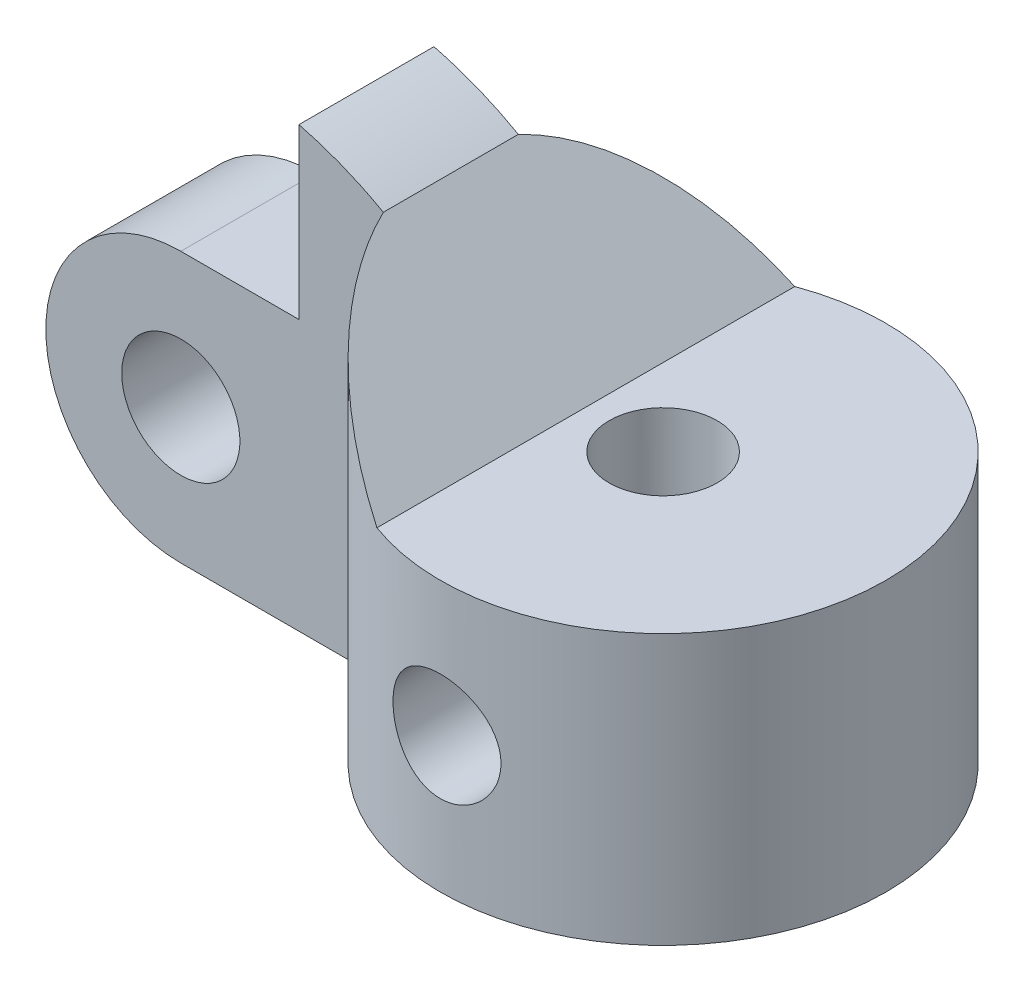
ISO-10303-21;
HEADER;
FILE_DESCRIPTION(('STEP AP214'),'2;1');
FILE_NAME('part.step','',(''),(''),'','','');
FILE_SCHEMA(('AUTOMOTIVE_DESIGN { 1 0 10303 214 1 1 1 1 }'));
ENDSEC;
DATA;
#1=APPLICATION_CONTEXT('core data for automotive mechanical design processes');
#2=APPLICATION_PROTOCOL_DEFINITION('international standard','automotive_design',2000,#1);
#3=PRODUCT_CONTEXT('',#1,'mechanical');
#4=PRODUCT('Part','Part','',(#3));
#5=PRODUCT_RELATED_PRODUCT_CATEGORY('part','',(#4));
#6=PRODUCT_DEFINITION_FORMATION('','',#4);
#7=PRODUCT_DEFINITION_CONTEXT('part definition',#1,'design');
#8=PRODUCT_DEFINITION('design','',#6,#7);
#9=PRODUCT_DEFINITION_SHAPE('','',#8);
#10=(LENGTH_UNIT() NAMED_UNIT(*) SI_UNIT(.MILLI.,.METRE.));
#11=(NAMED_UNIT(*) PLANE_ANGLE_UNIT() SI_UNIT($,.RADIAN.));
#12=(NAMED_UNIT(*) SI_UNIT($,.STERADIAN.) SOLID_ANGLE_UNIT());
#13=UNCERTAINTY_MEASURE_WITH_UNIT(LENGTH_MEASURE(1.E-05),#10,'distance_accuracy_value','');
#14=(GEOMETRIC_REPRESENTATION_CONTEXT(3) GLOBAL_UNCERTAINTY_ASSIGNED_CONTEXT((#13)) GLOBAL_UNIT_ASSIGNED_CONTEXT((#10,
#11,#12)) REPRESENTATION_CONTEXT('',''));
#15=CARTESIAN_POINT('',(0.,0.,0.));
#16=DIRECTION('',(0.,0.,1.));
#17=DIRECTION('',(1.,0.,0.));
#18=AXIS2_PLACEMENT_3D('',#15,#16,#17);
#19=CARTESIAN_POINT('',(0.,8.,0.));
#20=DIRECTION('',(0.,1.,0.));
#21=DIRECTION('',(0.,0.,1.));
#22=AXIS2_PLACEMENT_3D('',#19,#20,#21);
#23=PLANE('',#22);
#24=DIRECTION('',(1.,0.,0.));
#25=VECTOR('',#24,1.);
#26=CARTESIAN_POINT('',(0.,8.,2.));
#27=LINE('',#26,#25);
#28=CARTESIAN_POINT('',(-12.2896740774066,8.,2.));
#29=VERTEX_POINT('',#28);
#30=CARTESIAN_POINT('',(-8.78967407740655,8.,2.));
#31=VERTEX_POINT('',#30);
#32=EDGE_CURVE('E318',#29,#31,#27,.T.);
#33=ORIENTED_EDGE('',*,*,#32,.T.);
#34=DIRECTION('',(0.,0.,1.));
#35=VECTOR('',#34,1.);
#36=CARTESIAN_POINT('',(-8.78967407740655,8.,-2.));
#37=LINE('',#36,#35);
#38=CARTESIAN_POINT('',(-8.78967407740655,8.,-2.));
#39=VERTEX_POINT('',#38);
#40=EDGE_CURVE('E196',#39,#31,#37,.T.);
#41=ORIENTED_EDGE('',*,*,#40,.F.);
#42=DIRECTION('',(1.,0.,0.));
#43=VECTOR('',#42,1.);
#44=CARTESIAN_POINT('',(0.,8.,-2.));
#45=LINE('',#44,#43);
#46=CARTESIAN_POINT('',(-12.2896740774066,8.,-2.));
#47=VERTEX_POINT('',#46);
#48=EDGE_CURVE('E392',#47,#39,#45,.T.);
#49=ORIENTED_EDGE('',*,*,#48,.F.);
#50=DIRECTION('',(0.,0.,1.));
#51=VECTOR('',#50,1.);
#52=CARTESIAN_POINT('',(-12.2896740774066,8.,-6.6));
#53=LINE('',#52,#51);
#54=EDGE_CURVE('E339',#47,#29,#53,.T.);
#55=ORIENTED_EDGE('',*,*,#54,.T.);
#56=EDGE_LOOP('',(#33,#41,#49,#55));
#57=FACE_BOUND('',#56,.T.);
#58=ADVANCED_FACE('F98',(#57),#23,.T.);
#59=CARTESIAN_POINT('',(0.,8.,0.));
#60=DIRECTION('',(0.,1.,0.));
#61=DIRECTION('',(0.,0.,1.));
#62=AXIS2_PLACEMENT_3D('',#59,#60,#61);
#63=CIRCLE('',#62,1.6);
#64=CARTESIAN_POINT('',(0.,8.,1.6));
#65=VERTEX_POINT('',#64);
#66=EDGE_CURVE('E377',#65,#65,#63,.T.);
#67=ORIENTED_EDGE('',*,*,#66,.F.);
#68=EDGE_LOOP('',(#67));
#69=FACE_BOUND('',#68,.T.);
#70=CARTESIAN_POINT('',(0.,8.,0.));
#71=DIRECTION('',(0.,1.,0.));
#72=DIRECTION('',(0.,0.,1.));
#73=AXIS2_PLACEMENT_3D('',#70,#71,#72);
#74=CIRCLE('',#73,6.6);
#75=CARTESIAN_POINT('',(-2.28967407740657,8.,6.19010441101379));
#76=VERTEX_POINT('',#75);
#77=CARTESIAN_POINT('',(-2.28967407740657,8.,-6.19010441101379));
#78=VERTEX_POINT('',#77);
#79=EDGE_CURVE('E396',#76,#78,#74,.T.);
#80=ORIENTED_EDGE('',*,*,#79,.T.);
#81=DIRECTION('',(0.,0.,1.));
#82=VECTOR('',#81,1.);
#83=CARTESIAN_POINT('',(-2.28967407740657,8.,0.));
#84=LINE('',#83,#82);
#85=EDGE_CURVE('E329',#78,#76,#84,.T.);
#86=ORIENTED_EDGE('',*,*,#85,.T.);
#87=EDGE_LOOP('',(#80,#86));
#88=FACE_BOUND('',#87,.T.);
#89=ADVANCED_FACE('F300',(#69,#88),#23,.T.);
#90=CARTESIAN_POINT('',(0.,8.,-2.));
#91=DIRECTION('',(0.,0.,-1.));
#92=DIRECTION('',(-1.,0.,0.));
#93=AXIS2_PLACEMENT_3D('',#90,#91,#92);
#94=PLANE('',#93);
#95=CARTESIAN_POINT('',(-12.2896740774066,4.,-2.));
#96=DIRECTION('',(0.,0.,-1.));
#97=DIRECTION('',(-1.,0.,0.));
#98=AXIS2_PLACEMENT_3D('',#95,#96,#97);
#99=CIRCLE('',#98,1.75);
#100=CARTESIAN_POINT('',(-14.0396740774066,4.,-2.));
#101=VERTEX_POINT('',#100);
#102=EDGE_CURVE('E284',#101,#101,#99,.T.);
#103=ORIENTED_EDGE('',*,*,#102,.F.);
#104=EDGE_LOOP('',(#103));
#105=FACE_BOUND('',#104,.T.);
#106=DIRECTION('',(0.,-1.,0.));
#107=VECTOR('',#106,1.);
#108=CARTESIAN_POINT('',(-8.78967407740655,13.,-2.));
#109=LINE('',#108,#107);
#110=CARTESIAN_POINT('',(-8.78967407740655,13.,-2.));
#111=VERTEX_POINT('',#110);
#112=EDGE_CURVE('E200',#111,#39,#109,.T.);
#113=ORIENTED_EDGE('',*,*,#112,.F.);
#114=CARTESIAN_POINT('',(-6.28967407740656,12.,-2.));
#115=CARTESIAN_POINT('',(-7.47174105913595,12.6698325456765,-2.));
#116=CARTESIAN_POINT('',(-8.78967407740655,13.,-2.));
#117=(BOUNDED_CURVE() B_SPLINE_CURVE(2,(#114,#115,#116),.UNSPECIFIED.,.F.,
.F.) B_SPLINE_CURVE_WITH_KNOTS((3,3),(0.,1.),
.UNSPECIFIED.) CURVE() GEOMETRIC_REPRESENTATION_ITEM() RATIONAL_B_SPLINE_CURVE((1.,
0.990896059130321,1.)) REPRESENTATION_ITEM(''));
#118=CARTESIAN_POINT('',(-6.28967407740656,12.,-2.));
#119=VERTEX_POINT('',#118);
#120=EDGE_CURVE('E114',#111,#119,#117,.F.);
#121=ORIENTED_EDGE('',*,*,#120,.T.);
#122=DIRECTION('',(0.,-1.,0.));
#123=VECTOR('',#122,1.);
#124=CARTESIAN_POINT('',(-6.28967407740656,8.,-2.));
#125=LINE('',#124,#123);
#126=CARTESIAN_POINT('',(-6.28967407740656,0.,-2.));
#127=VERTEX_POINT('',#126);
#128=EDGE_CURVE('E317',#119,#127,#125,.T.);
#129=ORIENTED_EDGE('',*,*,#128,.T.);
#130=DIRECTION('',(1.,0.,0.));
#131=VECTOR('',#130,1.);
#132=CARTESIAN_POINT('',(0.,0.,-2.));
#133=LINE('',#132,#131);
#134=CARTESIAN_POINT('',(-12.2896740774066,0.,-2.));
#135=VERTEX_POINT('',#134);
#136=EDGE_CURVE('E378',#135,#127,#133,.T.);
#137=ORIENTED_EDGE('',*,*,#136,.F.);
#138=CARTESIAN_POINT('',(-12.2896740774066,4.,-2.));
#139=DIRECTION('',(0.,0.,-1.));
#140=DIRECTION('',(-1.,0.,0.));
#141=AXIS2_PLACEMENT_3D('',#138,#139,#140);
#142=CIRCLE('',#141,4.);
#143=EDGE_CURVE('E389',#135,#47,#142,.T.);
#144=ORIENTED_EDGE('',*,*,#143,.T.);
#145=ORIENTED_EDGE('',*,*,#48,.T.);
#146=EDGE_LOOP('',(#113,#121,#129,#137,#144,#145));
#147=FACE_BOUND('',#146,.T.);
#148=ADVANCED_FACE('F265',(#105,#147),#94,.T.);
#149=CARTESIAN_POINT('',(0.,8.,2.));
#150=DIRECTION('',(0.,0.,-1.));
#151=DIRECTION('',(-1.,0.,0.));
#152=AXIS2_PLACEMENT_3D('',#149,#150,#151);
#153=PLANE('',#152);
#154=CARTESIAN_POINT('',(-12.2896740774066,4.,2.));
#155=DIRECTION('',(0.,0.,-1.));
#156=DIRECTION('',(-1.,0.,0.));
#157=AXIS2_PLACEMENT_3D('',#154,#155,#156);
#158=CIRCLE('',#157,1.75);
#159=CARTESIAN_POINT('',(-14.0396740774066,4.,2.));
#160=VERTEX_POINT('',#159);
#161=EDGE_CURVE('E283',#160,#160,#158,.T.);
#162=ORIENTED_EDGE('',*,*,#161,.T.);
#163=EDGE_LOOP('',(#162));
#164=FACE_BOUND('',#163,.T.);
#165=DIRECTION('',(0.,-1.,0.));
#166=VECTOR('',#165,1.);
#167=CARTESIAN_POINT('',(-6.28967407740656,8.,2.));
#168=LINE('',#167,#166);
#169=CARTESIAN_POINT('',(-6.28967407740656,12.,2.));
#170=VERTEX_POINT('',#169);
#171=CARTESIAN_POINT('',(-6.28967407740656,0.,2.));
#172=VERTEX_POINT('',#171);
#173=EDGE_CURVE('E120',#170,#172,#168,.T.);
#174=ORIENTED_EDGE('',*,*,#173,.F.);
#175=CARTESIAN_POINT('',(-8.78967407740656,13.,2.));
#176=CARTESIAN_POINT('',(-7.47174105913595,12.6698325456765,2.));
#177=CARTESIAN_POINT('',(-6.28967407740656,12.,2.));
#178=(BOUNDED_CURVE() B_SPLINE_CURVE(2,(#175,#176,#177),.UNSPECIFIED.,.F.,
.F.) B_SPLINE_CURVE_WITH_KNOTS((3,3),(0.,1.),
.UNSPECIFIED.) CURVE() GEOMETRIC_REPRESENTATION_ITEM() RATIONAL_B_SPLINE_CURVE((1.,
0.990896059130321,1.)) REPRESENTATION_ITEM(''));
#179=CARTESIAN_POINT('',(-8.78967407740655,13.,2.));
#180=VERTEX_POINT('',#179);
#181=EDGE_CURVE('E13',#170,#180,#178,.F.);
#182=ORIENTED_EDGE('',*,*,#181,.T.);
#183=DIRECTION('',(0.,-1.,0.));
#184=VECTOR('',#183,1.);
#185=CARTESIAN_POINT('',(-8.78967407740655,13.,2.));
#186=LINE('',#185,#184);
#187=EDGE_CURVE('E183',#180,#31,#186,.T.);
#188=ORIENTED_EDGE('',*,*,#187,.T.);
#189=ORIENTED_EDGE('',*,*,#32,.F.);
#190=CARTESIAN_POINT('',(-12.2896740774066,4.,2.));
#191=DIRECTION('',(0.,0.,-1.));
#192=DIRECTION('',(-1.,0.,0.));
#193=AXIS2_PLACEMENT_3D('',#190,#191,#192);
#194=CIRCLE('',#193,4.);
#195=CARTESIAN_POINT('',(-12.2896740774066,0.,2.));
#196=VERTEX_POINT('',#195);
#197=EDGE_CURVE('E404',#196,#29,#194,.T.);
#198=ORIENTED_EDGE('',*,*,#197,.F.);
#199=DIRECTION('',(1.,0.,0.));
#200=VECTOR('',#199,1.);
#201=CARTESIAN_POINT('',(0.,0.,2.));
#202=LINE('',#201,#200);
#203=EDGE_CURVE('E374',#196,#172,#202,.T.);
#204=ORIENTED_EDGE('',*,*,#203,.T.);
#205=EDGE_LOOP('',(#174,#182,#188,#189,#198,#204));
#206=FACE_BOUND('',#205,.T.);
#207=ADVANCED_FACE('F181',(#164,#206),#153,.F.);
#208=CARTESIAN_POINT('',(0.,8.,0.));
#209=DIRECTION('',(0.,-1.,0.));
#210=DIRECTION('',(0.,0.,-1.));
#211=AXIS2_PLACEMENT_3D('',#208,#209,#210);
#212=CYLINDRICAL_SURFACE('',#211,1.6);
#213=CARTESIAN_POINT('',(0.,4.,0.));
#214=DIRECTION('',(0.,-0.707106781186547,0.707106781186547));
#215=DIRECTION('',(0.,-0.707106781186547,-0.707106781186547));
#216=AXIS2_PLACEMENT_3D('',#213,#214,#215);
#217=ELLIPSE('',#216,2.26274169979695,1.6);
#218=CARTESIAN_POINT('',(-1.6,4.,0.));
#219=VERTEX_POINT('',#218);
#220=CARTESIAN_POINT('',(1.6,4.,0.));
#221=VERTEX_POINT('',#220);
#222=EDGE_CURVE('E355',#219,#221,#217,.F.);
#223=ORIENTED_EDGE('',*,*,#222,.F.);
#224=CARTESIAN_POINT('',(0.,4.,0.));
#225=DIRECTION('',(0.,-0.707106781186547,-0.707106781186547));
#226=DIRECTION('',(0.,-0.707106781186547,0.707106781186547));
#227=AXIS2_PLACEMENT_3D('',#224,#225,#226);
#228=ELLIPSE('',#227,2.26274169979695,1.6);
#229=EDGE_CURVE('E147',#221,#219,#228,.F.);
#230=ORIENTED_EDGE('',*,*,#229,.F.);
#231=EDGE_LOOP('',(#223,#230));
#232=FACE_BOUND('',#231,.T.);
#233=ORIENTED_EDGE('',*,*,#66,.T.);
#234=EDGE_LOOP('',(#233));
#235=FACE_BOUND('',#234,.T.);
#236=ADVANCED_FACE('F259',(#232,#235),#212,.F.);
#237=CARTESIAN_POINT('',(0.,0.,0.));
#238=DIRECTION('',(0.,1.,0.));
#239=DIRECTION('',(0.,0.,1.));
#240=AXIS2_PLACEMENT_3D('',#237,#238,#239);
#241=PLANE('',#240);
#242=CARTESIAN_POINT('',(0.,0.,0.));
#243=DIRECTION('',(0.,1.,0.));
#244=DIRECTION('',(0.,0.,1.));
#245=AXIS2_PLACEMENT_3D('',#242,#243,#244);
#246=CIRCLE('',#245,1.6);
#247=CARTESIAN_POINT('',(0.,0.,1.6));
#248=VERTEX_POINT('',#247);
#249=EDGE_CURVE('E385',#248,#248,#246,.T.);
#250=ORIENTED_EDGE('',*,*,#249,.T.);
#251=EDGE_LOOP('',(#250));
#252=FACE_BOUND('',#251,.T.);
#253=DIRECTION('',(0.,0.,1.));
#254=VECTOR('',#253,1.);
#255=CARTESIAN_POINT('',(-12.2896740774066,0.,-6.6));
#256=LINE('',#255,#254);
#257=EDGE_CURVE('E367',#135,#196,#256,.T.);
#258=ORIENTED_EDGE('',*,*,#257,.F.);
#259=ORIENTED_EDGE('',*,*,#136,.T.);
#260=CARTESIAN_POINT('',(0.,0.,0.));
#261=DIRECTION('',(0.,1.,0.));
#262=DIRECTION('',(0.,0.,1.));
#263=AXIS2_PLACEMENT_3D('',#260,#261,#262);
#264=CIRCLE('',#263,6.6);
#265=EDGE_CURVE('E381',#172,#127,#264,.T.);
#266=ORIENTED_EDGE('',*,*,#265,.F.);
#267=ORIENTED_EDGE('',*,*,#203,.F.);
#268=EDGE_LOOP('',(#258,#259,#266,#267));
#269=FACE_BOUND('',#268,.T.);
#270=ADVANCED_FACE('F263',(#252,#269),#241,.F.);
#271=CARTESIAN_POINT('',(0.,8.,0.));
#272=DIRECTION('',(0.,-1.,0.));
#273=DIRECTION('',(0.,0.,-1.));
#274=AXIS2_PLACEMENT_3D('',#271,#272,#273);
#275=CYLINDRICAL_SURFACE('',#274,6.6);
#276=CARTESIAN_POINT('',(1.6,4.,-6.40312423743285));
#277=CARTESIAN_POINT('',(1.59999733947836,4.08844402406098,-6.40312597037609));
#278=CARTESIAN_POINT('',(1.59264157848281,4.17691809600071,-6.40497670400888));
#279=CARTESIAN_POINT('',(1.56345601743318,4.35133182154082,-6.4121621325328));
#280=CARTESIAN_POINT('',(1.54161728105349,4.43726987614424,-6.41749897840401));
#281=CARTESIAN_POINT('',(1.48420900234039,4.60406355514517,-6.43101748536075));
#282=CARTESIAN_POINT('',(1.44865650524925,4.68492534448298,-6.43919561368331));
#283=CARTESIAN_POINT('',(1.3648810998873,4.83954379086885,-6.45747086045777));
#284=CARTESIAN_POINT('',(1.31665785249965,4.91330025767959,-6.46756803026843));
#285=CARTESIAN_POINT('',(1.20784389900135,5.05314159602282,-6.48877758318028));
#286=CARTESIAN_POINT('',(1.14703929913897,5.11905772455782,-6.49990538881894));
#287=CARTESIAN_POINT('',(1.01524965153105,5.23986289597431,-6.5217882988137));
#288=CARTESIAN_POINT('',(0.944263695721746,5.29475095422509,-6.53254336981968));
#289=CARTESIAN_POINT('',(0.792976530006599,5.39262652396975,-6.55263898037571));
#290=CARTESIAN_POINT('',(0.71256570600993,5.43544913714583,-6.56195919706409));
#291=CARTESIAN_POINT('',(0.545423893058168,5.50690743021361,-6.57795945463852));
#292=CARTESIAN_POINT('',(0.458693781262912,5.53554507478769,-6.58463986112431));
#293=CARTESIAN_POINT('',(0.28313343703087,5.57728248350463,-6.59449878121048));
#294=CARTESIAN_POINT('',(0.194374956348101,5.59066857236418,-6.59774174354862));
#295=CARTESIAN_POINT('',(0.0158168750524344,5.60242074593819,-6.60058464260182));
#296=CARTESIAN_POINT('',(-0.0739825787233714,5.60078892390197,-6.60018508702391));
#297=CARTESIAN_POINT('',(-0.25009076322241,5.5827593886002,-6.59583627033507));
#298=CARTESIAN_POINT('',(-0.336433231377963,5.56667061845232,-6.59196128200833));
#299=CARTESIAN_POINT('',(-0.505154519829912,5.52067938716169,-6.58118299179282));
#300=CARTESIAN_POINT('',(-0.587533136198652,5.49077621614884,-6.57427953428333));
#301=CARTESIAN_POINT('',(-0.74681326529544,5.41774922909505,-6.55810487467464));
#302=CARTESIAN_POINT('',(-0.823661440791099,5.37451366657421,-6.54881377443151));
#303=CARTESIAN_POINT('',(-0.969121094903154,5.27613357148008,-6.52887450690487));
#304=CARTESIAN_POINT('',(-1.03773121476807,5.22098707855287,-6.51822611635086));
#305=CARTESIAN_POINT('',(-1.16660863727456,5.09868762962085,-6.49641521034034));
#306=CARTESIAN_POINT('',(-1.22661882104947,5.03126455163238,-6.48524650824044));
#307=CARTESIAN_POINT('',(-1.33453585965573,4.88719490884861,-6.46390352969242));
#308=CARTESIAN_POINT('',(-1.38244221584308,4.81054796424765,-6.45372929422414));
#309=CARTESIAN_POINT('',(-1.46494322915083,4.64972470273884,-6.43550637883586));
#310=CARTESIAN_POINT('',(-1.4994794029305,4.56551724795948,-6.42746708453676));
#311=CARTESIAN_POINT('',(-1.55382718977604,4.39225039215391,-6.41454673226991));
#312=CARTESIAN_POINT('',(-1.57364174189015,4.30319196339657,-6.40966504393782));
#313=CARTESIAN_POINT('',(-1.59756435294379,4.12512682937485,-6.40374402358904));
#314=CARTESIAN_POINT('',(-1.60205110778769,4.03617402039503,-6.40261207062851));
#315=CARTESIAN_POINT('',(-1.59622462099622,3.85879092404816,-6.40406713975094));
#316=CARTESIAN_POINT('',(-1.58591265192973,3.77036059240892,-6.4066538420601));
#317=CARTESIAN_POINT('',(-1.55111264233716,3.59791634012609,-6.41516633208495));
#318=CARTESIAN_POINT('',(-1.52684202876438,3.51385577255964,-6.42104086992378));
#319=CARTESIAN_POINT('',(-1.46505330245464,3.35099563472862,-6.43541907577093));
#320=CARTESIAN_POINT('',(-1.427533693674,3.27219665978537,-6.44392304067414));
#321=CARTESIAN_POINT('',(-1.33950890361332,3.12048324751841,-6.46279907110407));
#322=CARTESIAN_POINT('',(-1.28877556385843,3.04770522515797,-6.47320288866304));
#323=CARTESIAN_POINT('',(-1.176054449739,2.91155642689974,-6.49462703788132));
#324=CARTESIAN_POINT('',(-1.11406494115952,2.84818710331931,-6.50564746435902));
#325=CARTESIAN_POINT('',(-0.978859243852804,2.73113684816081,-6.52737484171816));
#326=CARTESIAN_POINT('',(-0.905414542587484,2.67771694544761,-6.5380684476914));
#327=CARTESIAN_POINT('',(-0.750376177663217,2.58397023624514,-6.55766967940658));
#328=CARTESIAN_POINT('',(-0.668782931491631,2.54364275942034,-6.56657739657757));
#329=CARTESIAN_POINT('',(-0.500317828978865,2.47756489223356,-6.58154809251216));
#330=CARTESIAN_POINT('',(-0.413487967421985,2.45171216041208,-6.58763099011155));
#331=CARTESIAN_POINT('',(-0.236550277056997,2.41500676666825,-6.59635362322054));
#332=CARTESIAN_POINT('',(-0.146443043735652,2.40415139361489,-6.5989939810466));
#333=CARTESIAN_POINT('',(0.0320330834287471,2.39789370197624,-6.60051038370048));
#334=CARTESIAN_POINT('',(0.120387845166776,2.4021050810357,-6.59948053308083));
#335=CARTESIAN_POINT('',(0.295090603727327,2.42498180031035,-6.59397912156365));
#336=CARTESIAN_POINT('',(0.381438653778092,2.44364675669111,-6.58950765206303));
#337=CARTESIAN_POINT('',(0.549299070646439,2.49469887896567,-6.57763810488231));
#338=CARTESIAN_POINT('',(0.630832598167391,2.52701996018495,-6.57025413266408));
#339=CARTESIAN_POINT('',(0.787364816025318,2.60440616156891,-6.55333973860274));
#340=CARTESIAN_POINT('',(0.862362725594601,2.64947280163974,-6.54380906079289));
#341=CARTESIAN_POINT('',(1.00554031833552,2.75226967813651,-6.52336129617945));
#342=CARTESIAN_POINT('',(1.07352623332947,2.81026451788978,-6.51241761643753));
#343=CARTESIAN_POINT('',(1.19893242972994,2.93675265363601,-6.49050250288316));
#344=CARTESIAN_POINT('',(1.25635006733463,3.00524856878544,-6.47953106282008));
#345=CARTESIAN_POINT('',(1.35995880768537,3.15221778456658,-6.45858815699281));
#346=CARTESIAN_POINT('',(1.40593901379458,3.23084290180638,-6.448637221504));
#347=CARTESIAN_POINT('',(1.48395977964431,3.39493550764195,-6.43113315660768));
#348=CARTESIAN_POINT('',(1.51601091235572,3.48039774791219,-6.42357820968792));
#349=CARTESIAN_POINT('',(1.56024691692113,3.63814570603387,-6.41295817096726));
#350=CARTESIAN_POINT('',(1.57512286070378,3.70964864102359,-6.40929733413103));
#351=CARTESIAN_POINT('',(1.59500013121856,3.85409430607224,-6.40437974225737));
#352=CARTESIAN_POINT('',(1.60000219483265,3.92703692827776,-6.40312280781832));
#353=CARTESIAN_POINT('',(1.6,4.,-6.40312423743285));
#354=B_SPLINE_CURVE_WITH_KNOTS('',3,(#276,#277,#278,#279,#280,#281,#282,#283,#284,#285,#286,
#287,#288,#289,#290,#291,#292,#293,#294,#295,#296,#297,#298,#299,#300,#301,#302,#303,#304,#305,
#306,#307,#308,#309,#310,#311,#312,#313,#314,#315,#316,#317,#318,#319,#320,#321,#322,#323,#324,
#325,#326,#327,#328,#329,#330,#331,#332,#333,#334,#335,#336,#337,#338,#339,#340,#341,#342,#343,
#344,#345,#346,#347,#348,#349,#350,#351,#352,#353),.UNSPECIFIED.,.T.,.F.,(4,2,2,2,2,2,2,2,2,2,2,
2,2,2,2,2,2,2,2,2,2,2,2,2,2,2,2,2,2,2,2,2,2,2,2,2,2,2,4),(0.,0.265064273258436,
0.530292249566571,0.795191622869191,1.0600980865956,1.32994540119492,1.59981679815771,
1.87321504847942,2.14657542130955,2.41471463941518,2.68281648389817,2.94532180998148,
3.20784062672676,3.47262248908861,3.73744796368044,4.00902119378664,4.28060561013037,
4.55336490852977,4.82606973818098,5.09198626575298,5.35787992805489,5.619739930883,
5.88162951175322,6.1483813618781,6.41517434484027,6.68820231251325,6.96121629887957,
7.23227478485269,7.50328426411234,7.76739558504667,8.03149989238554,8.29434052625653,
8.55721251706291,8.82606066778539,9.09497598347789,9.36853321512672,9.64188243681685,
9.86056704862862,10.0792353395176),.UNSPECIFIED.);
#355=CARTESIAN_POINT('',(1.6,4.,-6.40312423743285));
#356=VERTEX_POINT('',#355);
#357=EDGE_CURVE('E276',#356,#356,#354,.T.);
#358=ORIENTED_EDGE('',*,*,#357,.T.);
#359=EDGE_LOOP('',(#358));
#360=FACE_BOUND('',#359,.T.);
#361=CARTESIAN_POINT('',(1.6,4.,6.40312423743285));
#362=CARTESIAN_POINT('',(1.59999733947836,3.91155597593902,6.40312597037609));
#363=CARTESIAN_POINT('',(1.59264157848281,3.82308190399929,6.40497670400888));
#364=CARTESIAN_POINT('',(1.56345601743318,3.64866817845918,6.4121621325328));
#365=CARTESIAN_POINT('',(1.54161728105349,3.56273012385576,6.41749897840401));
#366=CARTESIAN_POINT('',(1.48420900234039,3.39593644485483,6.43101748536075));
#367=CARTESIAN_POINT('',(1.44865650524925,3.31507465551702,6.43919561368331));
#368=CARTESIAN_POINT('',(1.3648810998873,3.16045620913115,6.45747086045777));
#369=CARTESIAN_POINT('',(1.31665785249964,3.08669974232041,6.46756803026843));
#370=CARTESIAN_POINT('',(1.20784389900135,2.94685840397718,6.48877758318028));
#371=CARTESIAN_POINT('',(1.14703929913897,2.88094227544218,6.49990538881894));
#372=CARTESIAN_POINT('',(1.01524965153105,2.76013710402569,6.5217882988137));
#373=CARTESIAN_POINT('',(0.944263695721746,2.70524904577491,6.53254336981968));
#374=CARTESIAN_POINT('',(0.792976530006598,2.60737347603025,6.55263898037571));
#375=CARTESIAN_POINT('',(0.712565706009929,2.56455086285417,6.56195919706409));
#376=CARTESIAN_POINT('',(0.545423893058167,2.49309256978639,6.57795945463852));
#377=CARTESIAN_POINT('',(0.458693781262911,2.46445492521231,6.58463986112431));
#378=CARTESIAN_POINT('',(0.283133437030869,2.42271751649537,6.59449878121048));
#379=CARTESIAN_POINT('',(0.1943749563481,2.40933142763582,6.59774174354862));
#380=CARTESIAN_POINT('',(0.015816875052433,2.39757925406181,6.60058464260182));
#381=CARTESIAN_POINT('',(-0.0739825787233729,2.39921107609803,6.60018508702391));
#382=CARTESIAN_POINT('',(-0.250090763222411,2.4172406113998,6.59583627033507));
#383=CARTESIAN_POINT('',(-0.336433231377964,2.43332938154768,6.59196128200833));
#384=CARTESIAN_POINT('',(-0.505154519829913,2.47932061283831,6.58118299179282));
#385=CARTESIAN_POINT('',(-0.587533136198653,2.50922378385116,6.57427953428333));
#386=CARTESIAN_POINT('',(-0.746813265295442,2.58225077090495,6.55810487467464));
#387=CARTESIAN_POINT('',(-0.823661440791101,2.62548633342579,6.54881377443151));
#388=CARTESIAN_POINT('',(-0.969121094903155,2.72386642851992,6.52887450690487));
#389=CARTESIAN_POINT('',(-1.03773121476807,2.77901292144713,6.51822611635086));
#390=CARTESIAN_POINT('',(-1.16660863727457,2.90131237037916,6.49641521034034));
#391=CARTESIAN_POINT('',(-1.22661882104947,2.96873544836762,6.48524650824044));
#392=CARTESIAN_POINT('',(-1.33453585965573,3.11280509115139,6.46390352969242));
#393=CARTESIAN_POINT('',(-1.38244221584308,3.18945203575236,6.45372929422414));
#394=CARTESIAN_POINT('',(-1.46494322915083,3.35027529726117,6.43550637883586));
#395=CARTESIAN_POINT('',(-1.4994794029305,3.43448275204052,6.42746708453676));
#396=CARTESIAN_POINT('',(-1.55382718977604,3.60774960784609,6.41454673226991));
#397=CARTESIAN_POINT('',(-1.57364174189015,3.69680803660343,6.40966504393782));
#398=CARTESIAN_POINT('',(-1.59756435294379,3.87487317062515,6.40374402358904));
#399=CARTESIAN_POINT('',(-1.60205110778769,3.96382597960497,6.40261207062851));
#400=CARTESIAN_POINT('',(-1.59622462099622,4.14120907595185,6.40406713975094));
#401=CARTESIAN_POINT('',(-1.58591265192973,4.22963940759109,6.4066538420601));
#402=CARTESIAN_POINT('',(-1.55111264233716,4.40208365987391,6.41516633208495));
#403=CARTESIAN_POINT('',(-1.52684202876438,4.48614422744036,6.42104086992378));
#404=CARTESIAN_POINT('',(-1.46505330245464,4.64900436527138,6.43541907577093));
#405=CARTESIAN_POINT('',(-1.427533693674,4.72780334021463,6.44392304067414));
#406=CARTESIAN_POINT('',(-1.33950890361332,4.87951675248159,6.46279907110407));
#407=CARTESIAN_POINT('',(-1.28877556385843,4.95229477484203,6.47320288866304));
#408=CARTESIAN_POINT('',(-1.176054449739,5.08844357310027,6.49462703788132));
#409=CARTESIAN_POINT('',(-1.11406494115952,5.15181289668069,6.50564746435903));
#410=CARTESIAN_POINT('',(-0.978859243852802,5.2688631518392,6.52737484171817));
#411=CARTESIAN_POINT('',(-0.905414542587482,5.3222830545524,6.5380684476914));
#412=CARTESIAN_POINT('',(-0.750376177663215,5.41602976375486,6.55766967940658));
#413=CARTESIAN_POINT('',(-0.668782931491629,5.45635724057966,6.56657739657757));
#414=CARTESIAN_POINT('',(-0.500317828978863,5.52243510776645,6.58154809251216));
#415=CARTESIAN_POINT('',(-0.413487967421983,5.54828783958792,6.58763099011155));
#416=CARTESIAN_POINT('',(-0.236550277056996,5.58499323333175,6.59635362322054));
#417=CARTESIAN_POINT('',(-0.14644304373565,5.59584860638511,6.5989939810466));
#418=CARTESIAN_POINT('',(0.0320330834287485,5.60210629802376,6.60051038370048));
#419=CARTESIAN_POINT('',(0.120387845166777,5.5978949189643,6.59948053308083));
#420=CARTESIAN_POINT('',(0.295090603727328,5.57501819968965,6.59397912156365));
#421=CARTESIAN_POINT('',(0.381438653778093,5.55635324330889,6.58950765206303));
#422=CARTESIAN_POINT('',(0.549299070646441,5.50530112103433,6.57763810488231));
#423=CARTESIAN_POINT('',(0.630832598167394,5.47298003981505,6.57025413266408));
#424=CARTESIAN_POINT('',(0.787364816025321,5.39559383843109,6.55333973860274));
#425=CARTESIAN_POINT('',(0.862362725594603,5.35052719836026,6.54380906079289));
#426=CARTESIAN_POINT('',(1.00554031833552,5.24773032186349,6.52336129617945));
#427=CARTESIAN_POINT('',(1.07352623332948,5.18973548211022,6.51241761643753));
#428=CARTESIAN_POINT('',(1.19893242972994,5.06324734636399,6.49050250288316));
#429=CARTESIAN_POINT('',(1.25635006733463,4.99475143121456,6.47953106282008));
#430=CARTESIAN_POINT('',(1.35995880768537,4.84778221543341,6.45858815699281));
#431=CARTESIAN_POINT('',(1.40593901379458,4.76915709819362,6.448637221504));
#432=CARTESIAN_POINT('',(1.48395977964431,4.60506449235805,6.43113315660768));
#433=CARTESIAN_POINT('',(1.51601091235572,4.51960225208781,6.42357820968792));
#434=CARTESIAN_POINT('',(1.56024691692113,4.36185429396613,6.41295817096726));
#435=CARTESIAN_POINT('',(1.57512286070378,4.29035135897641,6.40929733413103));
#436=CARTESIAN_POINT('',(1.59500013121856,4.14590569392776,6.40437974225737));
#437=CARTESIAN_POINT('',(1.60000219483265,4.07296307172224,6.40312280781832));
#438=CARTESIAN_POINT('',(1.6,4.,6.40312423743285));
#439=B_SPLINE_CURVE_WITH_KNOTS('',3,(#361,#362,#363,#364,#365,#366,#367,#368,#369,#370,#371,
#372,#373,#374,#375,#376,#377,#378,#379,#380,#381,#382,#383,#384,#385,#386,#387,#388,#389,#390,
#391,#392,#393,#394,#395,#396,#397,#398,#399,#400,#401,#402,#403,#404,#405,#406,#407,#408,#409,
#410,#411,#412,#413,#414,#415,#416,#417,#418,#419,#420,#421,#422,#423,#424,#425,#426,#427,#428,
#429,#430,#431,#432,#433,#434,#435,#436,#437,#438),.UNSPECIFIED.,.T.,.F.,(4,2,2,2,2,2,2,2,2,2,2,
2,2,2,2,2,2,2,2,2,2,2,2,2,2,2,2,2,2,2,2,2,2,2,2,2,2,2,4),(0.,0.265064273258436,
0.530292249566571,0.795191622869193,1.0600980865956,1.32994540119492,1.59981679815771,
1.87321504847942,2.14657542130956,2.41471463941518,2.68281648389817,2.94532180998148,
3.20784062672676,3.47262248908861,3.73744796368044,4.00902119378665,4.28060561013037,
4.55336490852977,4.82606973818099,5.09198626575298,5.3578799280549,5.619739930883,
5.88162951175322,6.1483813618781,6.41517434484028,6.68820231251325,6.96121629887958,
7.23227478485269,7.50328426411234,7.76739558504667,8.03149989238554,8.29434052625654,
8.55721251706292,8.82606066778539,9.09497598347789,9.36853321512673,9.64188243681686,
9.86056704862863,10.0792353395176),.UNSPECIFIED.);
#440=CARTESIAN_POINT('',(1.6,4.,6.40312423743285));
#441=VERTEX_POINT('',#440);
#442=EDGE_CURVE('E199',#441,#441,#439,.T.);
#443=ORIENTED_EDGE('',*,*,#442,.T.);
#444=EDGE_LOOP('',(#443));
#445=FACE_BOUND('',#444,.T.);
#446=ORIENTED_EDGE('',*,*,#265,.T.);
#447=ORIENTED_EDGE('',*,*,#128,.F.);
#448=CARTESIAN_POINT('',(0.,5.7103259225934,0.));
#449=DIRECTION('',(-0.707106781186551,-0.707106781186544,0.));
#450=DIRECTION('',(0.707106781186544,-0.707106781186551,0.));
#451=AXIS2_PLACEMENT_3D('',#448,#449,#450);
#452=ELLIPSE('',#451,9.33380951166248,6.6);
#453=EDGE_CURVE('E129',#119,#78,#452,.T.);
#454=ORIENTED_EDGE('',*,*,#453,.T.);
#455=ORIENTED_EDGE('',*,*,#79,.F.);
#456=CARTESIAN_POINT('',(0.,5.7103259225934,0.));
#457=DIRECTION('',(-0.707106781186551,-0.707106781186544,0.));
#458=DIRECTION('',(0.707106781186544,-0.707106781186551,0.));
#459=AXIS2_PLACEMENT_3D('',#456,#457,#458);
#460=ELLIPSE('',#459,9.33380951166248,6.6);
#461=EDGE_CURVE('E321',#76,#170,#460,.T.);
#462=ORIENTED_EDGE('',*,*,#461,.T.);
#463=ORIENTED_EDGE('',*,*,#173,.T.);
#464=EDGE_LOOP('',(#446,#447,#454,#455,#462,#463));
#465=FACE_BOUND('',#464,.T.);
#466=ADVANCED_FACE('F257',(#360,#445,#465),#275,.T.);
#467=CARTESIAN_POINT('',(0.,4.,0.));
#468=DIRECTION('',(0.,-0.707106781186547,0.707106781186547));
#469=DIRECTION('',(0.,-0.707106781186547,-0.707106781186547));
#470=AXIS2_PLACEMENT_3D('',#467,#468,#469);
#471=ELLIPSE('',#470,2.26274169979695,1.6);
#472=EDGE_CURVE('E359',#219,#221,#471,.T.);
#473=ORIENTED_EDGE('',*,*,#472,.F.);
#474=CARTESIAN_POINT('',(0.,4.,0.));
#475=DIRECTION('',(0.,-0.707106781186547,-0.707106781186547));
#476=DIRECTION('',(0.,-0.707106781186547,0.707106781186547));
#477=AXIS2_PLACEMENT_3D('',#474,#475,#476);
#478=ELLIPSE('',#477,2.26274169979695,1.6);
#479=EDGE_CURVE('E362',#221,#219,#478,.T.);
#480=ORIENTED_EDGE('',*,*,#479,.F.);
#481=EDGE_LOOP('',(#473,#480));
#482=FACE_BOUND('',#481,.T.);
#483=ORIENTED_EDGE('',*,*,#249,.F.);
#484=EDGE_LOOP('',(#483));
#485=FACE_BOUND('',#484,.T.);
#486=ADVANCED_FACE('F253',(#482,#485),#212,.F.);
#487=CARTESIAN_POINT('',(-12.2896740774066,4.,-6.6));
#488=DIRECTION('',(0.,0.,1.));
#489=DIRECTION('',(1.,0.,0.));
#490=AXIS2_PLACEMENT_3D('',#487,#488,#489);
#491=CYLINDRICAL_SURFACE('',#490,4.);
#492=ORIENTED_EDGE('',*,*,#143,.F.);
#493=ORIENTED_EDGE('',*,*,#257,.T.);
#494=ORIENTED_EDGE('',*,*,#197,.T.);
#495=ORIENTED_EDGE('',*,*,#54,.F.);
#496=EDGE_LOOP('',(#492,#493,#494,#495));
#497=FACE_BOUND('',#496,.T.);
#498=ADVANCED_FACE('F256',(#497),#491,.T.);
#499=CARTESIAN_POINT('',(0.,4.,-6.6));
#500=DIRECTION('',(0.,0.,1.));
#501=DIRECTION('',(1.,0.,0.));
#502=AXIS2_PLACEMENT_3D('',#499,#500,#501);
#503=CYLINDRICAL_SURFACE('',#502,1.6);
#504=ORIENTED_EDGE('',*,*,#472,.T.);
#505=ORIENTED_EDGE('',*,*,#229,.T.);
#506=EDGE_LOOP('',(#504,#505));
#507=FACE_BOUND('',#506,.T.);
#508=ORIENTED_EDGE('',*,*,#357,.F.);
#509=EDGE_LOOP('',(#508));
#510=FACE_BOUND('',#509,.T.);
#511=ADVANCED_FACE('F286',(#507,#510),#503,.F.);
#512=ORIENTED_EDGE('',*,*,#222,.T.);
#513=ORIENTED_EDGE('',*,*,#479,.T.);
#514=EDGE_LOOP('',(#512,#513));
#515=FACE_BOUND('',#514,.T.);
#516=ORIENTED_EDGE('',*,*,#442,.F.);
#517=EDGE_LOOP('',(#516));
#518=FACE_BOUND('',#517,.T.);
#519=ADVANCED_FACE('F291',(#515,#518),#503,.F.);
#520=CARTESIAN_POINT('',(-12.2896740774066,4.,-6.6));
#521=DIRECTION('',(0.,0.,1.));
#522=DIRECTION('',(1.,0.,0.));
#523=AXIS2_PLACEMENT_3D('',#520,#521,#522);
#524=CYLINDRICAL_SURFACE('',#523,1.75);
#525=ORIENTED_EDGE('',*,*,#102,.T.);
#526=EDGE_LOOP('',(#525));
#527=FACE_BOUND('',#526,.T.);
#528=ORIENTED_EDGE('',*,*,#161,.F.);
#529=EDGE_LOOP('',(#528));
#530=FACE_BOUND('',#529,.T.);
#531=ADVANCED_FACE('F293',(#527,#530),#524,.F.);
#532=CARTESIAN_POINT('',(-8.78967407740655,13.,-2.));
#533=DIRECTION('',(1.,0.,0.));
#534=DIRECTION('',(0.,0.,-1.));
#535=AXIS2_PLACEMENT_3D('',#532,#533,#534);
#536=PLANE('',#535);
#537=ORIENTED_EDGE('',*,*,#40,.T.);
#538=ORIENTED_EDGE('',*,*,#187,.F.);
#539=CARTESIAN_POINT('',(-8.78967407740655,13.,-2.2));
#540=CARTESIAN_POINT('',(-8.78967407740655,13.,-0.733333333333332));
#541=CARTESIAN_POINT('',(-8.78967407740655,13.,0.733333333333336));
#542=CARTESIAN_POINT('',(-8.78967407740655,13.,2.2));
#543=(BOUNDED_CURVE() B_SPLINE_CURVE(3,(#539,#540,#541,#542),.UNSPECIFIED.,.F.,
.F.) B_SPLINE_CURVE_WITH_KNOTS((4,4),(-0.0042,0.0002),
.UNSPECIFIED.) CURVE() GEOMETRIC_REPRESENTATION_ITEM() RATIONAL_B_SPLINE_CURVE((1.,1.,1.,1.)) REPRESENTATION_ITEM(''));
#544=EDGE_CURVE('E194',#111,#180,#543,.T.);
#545=ORIENTED_EDGE('',*,*,#544,.F.);
#546=ORIENTED_EDGE('',*,*,#112,.T.);
#547=EDGE_LOOP('',(#537,#538,#545,#546));
#548=FACE_BOUND('',#547,.T.);
#549=ADVANCED_FACE('F193',(#548),#536,.F.);
#550=CARTESIAN_POINT('',(-6.28967407740656,12.,-2.));
#551=DIRECTION('',(-0.707106781186551,-0.707106781186544,0.));
#552=DIRECTION('',(0.,0.,-1.));
#553=AXIS2_PLACEMENT_3D('',#550,#551,#552);
#554=PLANE('',#553);
#555=ORIENTED_EDGE('',*,*,#461,.F.);
#556=ORIENTED_EDGE('',*,*,#85,.F.);
#557=ORIENTED_EDGE('',*,*,#453,.F.);
#558=CARTESIAN_POINT('',(-6.28967407740656,12.,2.2));
#559=CARTESIAN_POINT('',(-6.28967407740656,12.,0.733333333333336));
#560=CARTESIAN_POINT('',(-6.28967407740656,12.,-0.733333333333332));
#561=CARTESIAN_POINT('',(-6.28967407740656,12.,-2.2));
#562=(BOUNDED_CURVE() B_SPLINE_CURVE(3,(#558,#559,#560,#561),.UNSPECIFIED.,.F.,
.F.) B_SPLINE_CURVE_WITH_KNOTS((4,4),(-0.0042,0.0002),
.UNSPECIFIED.) CURVE() GEOMETRIC_REPRESENTATION_ITEM() RATIONAL_B_SPLINE_CURVE((1.,1.,1.,1.)) REPRESENTATION_ITEM(''));
#563=EDGE_CURVE('E227',#170,#119,#562,.T.);
#564=ORIENTED_EDGE('',*,*,#563,.F.);
#565=EDGE_LOOP('',(#555,#556,#557,#564));
#566=FACE_BOUND('',#565,.T.);
#567=ADVANCED_FACE('F242',(#566),#554,.F.);
#568=CARTESIAN_POINT('',(-8.78967407740655,13.,2.2));
#569=CARTESIAN_POINT('',(-8.78967407740655,13.,0.733333333333336));
#570=CARTESIAN_POINT('',(-8.78967407740655,13.,-0.733333333333332));
#571=CARTESIAN_POINT('',(-8.78967407740655,13.,-2.2));
#572=CARTESIAN_POINT('',(-7.47174105913595,12.6698325456765,2.2));
#573=CARTESIAN_POINT('',(-7.47174105913595,12.6698325456765,0.733333333333336));
#574=CARTESIAN_POINT('',(-7.47174105913595,12.6698325456765,-0.733333333333332));
#575=CARTESIAN_POINT('',(-7.47174105913595,12.6698325456765,-2.2));
#576=CARTESIAN_POINT('',(-6.28967407740656,12.,2.2));
#577=CARTESIAN_POINT('',(-6.28967407740656,12.,0.733333333333336));
#578=CARTESIAN_POINT('',(-6.28967407740656,12.,-0.733333333333332));
#579=CARTESIAN_POINT('',(-6.28967407740656,12.,-2.2));
#580=(BOUNDED_SURFACE() B_SPLINE_SURFACE(2,3,((#568,#569,#570,#571),(#572,#573,#574,#575),(#576,
#577,#578,#579)),.UNSPECIFIED.,.F.,.F.,.F.) B_SPLINE_SURFACE_WITH_KNOTS((3,3),(4,4),(0.,1.),
(-0.0042,0.0002),.UNSPECIFIED.) GEOMETRIC_REPRESENTATION_ITEM() RATIONAL_B_SPLINE_SURFACE(((1.,
1.,1.,1.),(0.990896059130321,0.990896059130321,0.990896059130321,0.990896059130321),(1.,1.,1.,1.))) REPRESENTATION_ITEM('') SURFACE());
#581=ORIENTED_EDGE('',*,*,#181,.F.);
#582=ORIENTED_EDGE('',*,*,#563,.T.);
#583=ORIENTED_EDGE('',*,*,#120,.F.);
#584=ORIENTED_EDGE('',*,*,#544,.T.);
#585=EDGE_LOOP('',(#581,#582,#583,#584));
#586=FACE_BOUND('',#585,.T.);
#587=ADVANCED_FACE('F101',(#586),#580,.T.);
#588=CLOSED_SHELL('',(#58,#89,#148,#207,#236,#270,#466,#486,#498,#511,#519,#531,#549,#567,#587));
#589=MANIFOLD_SOLID_BREP('B2',#588);
#590=ADVANCED_BREP_SHAPE_REPRESENTATION('',(#18,#589),#14);
#591=SHAPE_DEFINITION_REPRESENTATION(#9,#590);
ENDSEC;
END-ISO-10303-21;
